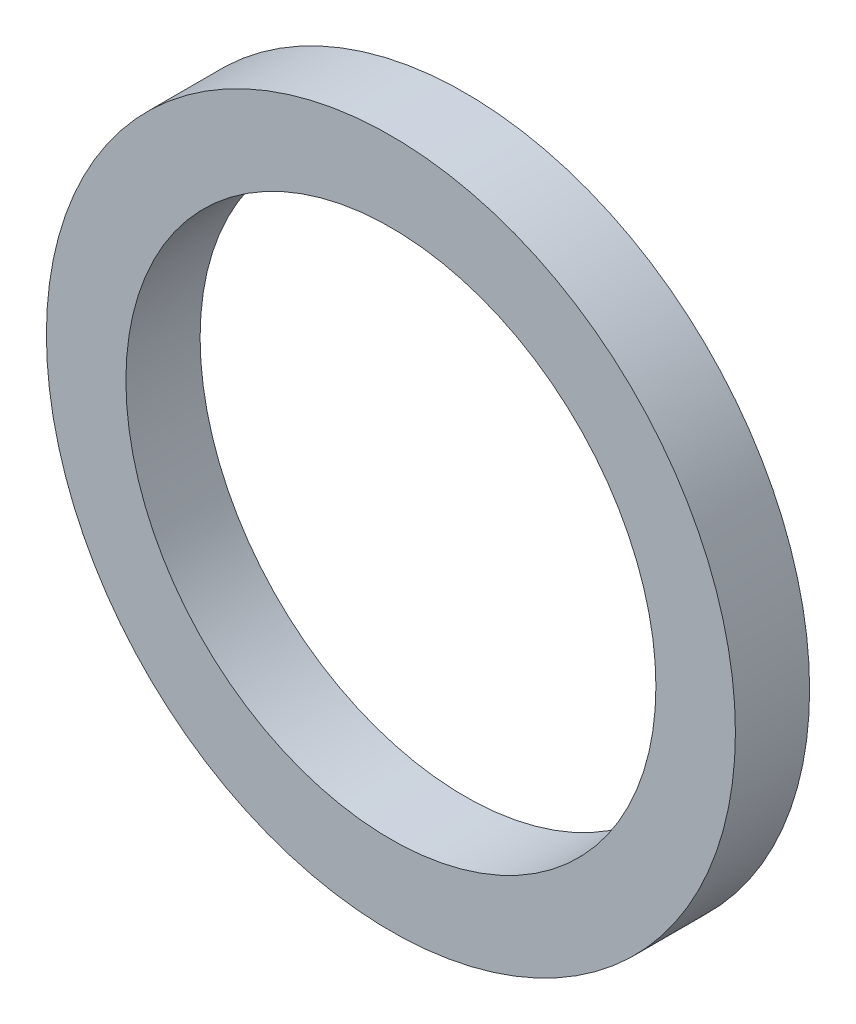
ISO-10303-21;
HEADER;
FILE_DESCRIPTION(('STEP AP214'),'2;1');
FILE_NAME('part.step','',(''),(''),'','','');
FILE_SCHEMA(('AUTOMOTIVE_DESIGN { 1 0 10303 214 1 1 1 1 }'));
ENDSEC;
DATA;
#1=APPLICATION_CONTEXT('core data for automotive mechanical design processes');
#2=APPLICATION_PROTOCOL_DEFINITION('international standard','automotive_design',2000,#1);
#3=PRODUCT_CONTEXT('',#1,'mechanical');
#4=PRODUCT('Part','Part','',(#3));
#5=PRODUCT_RELATED_PRODUCT_CATEGORY('part','',(#4));
#6=PRODUCT_DEFINITION_FORMATION('','',#4);
#7=PRODUCT_DEFINITION_CONTEXT('part definition',#1,'design');
#8=PRODUCT_DEFINITION('design','',#6,#7);
#9=PRODUCT_DEFINITION_SHAPE('','',#8);
#10=(LENGTH_UNIT() NAMED_UNIT(*) SI_UNIT(.MILLI.,.METRE.));
#11=(NAMED_UNIT(*) PLANE_ANGLE_UNIT() SI_UNIT($,.RADIAN.));
#12=(NAMED_UNIT(*) SI_UNIT($,.STERADIAN.) SOLID_ANGLE_UNIT());
#13=UNCERTAINTY_MEASURE_WITH_UNIT(LENGTH_MEASURE(1.E-05),#10,'distance_accuracy_value','');
#14=(GEOMETRIC_REPRESENTATION_CONTEXT(3) GLOBAL_UNCERTAINTY_ASSIGNED_CONTEXT((#13)) GLOBAL_UNIT_ASSIGNED_CONTEXT((#10,
#11,#12)) REPRESENTATION_CONTEXT('',''));
#15=CARTESIAN_POINT('',(0.,0.,0.));
#16=DIRECTION('',(0.,0.,1.));
#17=DIRECTION('',(1.,0.,0.));
#18=AXIS2_PLACEMENT_3D('',#15,#16,#17);
#19=CARTESIAN_POINT('',(0.,0.,7.));
#20=DIRECTION('',(0.,0.,1.));
#21=DIRECTION('',(1.,0.,0.));
#22=AXIS2_PLACEMENT_3D('',#19,#20,#21);
#23=PLANE('',#22);
#24=CARTESIAN_POINT('',(0.,0.,7.));
#25=DIRECTION('',(0.,0.,1.));
#26=DIRECTION('',(1.,0.,0.));
#27=AXIS2_PLACEMENT_3D('',#24,#25,#26);
#28=CIRCLE('',#27,32.5);
#29=CARTESIAN_POINT('',(32.5,0.,7.));
#30=VERTEX_POINT('',#29);
#31=EDGE_CURVE('E10',#30,#30,#28,.T.);
#32=ORIENTED_EDGE('',*,*,#31,.T.);
#33=EDGE_LOOP('',(#32));
#34=FACE_BOUND('',#33,.T.);
#35=CARTESIAN_POINT('',(0.,0.,7.));
#36=DIRECTION('',(0.,0.,1.));
#37=DIRECTION('',(1.,0.,0.));
#38=AXIS2_PLACEMENT_3D('',#35,#36,#37);
#39=CIRCLE('',#38,25.);
#40=CARTESIAN_POINT('',(25.,0.,7.));
#41=VERTEX_POINT('',#40);
#42=EDGE_CURVE('E42',#41,#41,#39,.T.);
#43=ORIENTED_EDGE('',*,*,#42,.F.);
#44=EDGE_LOOP('',(#43));
#45=FACE_BOUND('',#44,.T.);
#46=ADVANCED_FACE('F31',(#34,#45),#23,.T.);
#47=CARTESIAN_POINT('',(0.,0.,0.));
#48=DIRECTION('',(0.,0.,1.));
#49=DIRECTION('',(1.,0.,0.));
#50=AXIS2_PLACEMENT_3D('',#47,#48,#49);
#51=PLANE('',#50);
#52=CARTESIAN_POINT('',(0.,0.,0.));
#53=DIRECTION('',(0.,0.,1.));
#54=DIRECTION('',(1.,0.,0.));
#55=AXIS2_PLACEMENT_3D('',#52,#53,#54);
#56=CIRCLE('',#55,32.5);
#57=CARTESIAN_POINT('',(32.5,0.,0.));
#58=VERTEX_POINT('',#57);
#59=EDGE_CURVE('E35',#58,#58,#56,.T.);
#60=ORIENTED_EDGE('',*,*,#59,.F.);
#61=EDGE_LOOP('',(#60));
#62=FACE_BOUND('',#61,.T.);
#63=CARTESIAN_POINT('',(0.,0.,0.));
#64=DIRECTION('',(0.,0.,1.));
#65=DIRECTION('',(1.,0.,0.));
#66=AXIS2_PLACEMENT_3D('',#63,#64,#65);
#67=CIRCLE('',#66,25.);
#68=CARTESIAN_POINT('',(25.,0.,0.));
#69=VERTEX_POINT('',#68);
#70=EDGE_CURVE('E44',#69,#69,#67,.T.);
#71=ORIENTED_EDGE('',*,*,#70,.T.);
#72=EDGE_LOOP('',(#71));
#73=FACE_BOUND('',#72,.T.);
#74=ADVANCED_FACE('F54',(#62,#73),#51,.F.);
#75=CARTESIAN_POINT('',(0.,0.,7.));
#76=DIRECTION('',(0.,0.,-1.));
#77=DIRECTION('',(-1.,0.,0.));
#78=AXIS2_PLACEMENT_3D('',#75,#76,#77);
#79=CYLINDRICAL_SURFACE('',#78,32.5);
#80=ORIENTED_EDGE('',*,*,#31,.F.);
#81=EDGE_LOOP('',(#80));
#82=FACE_BOUND('',#81,.T.);
#83=ORIENTED_EDGE('',*,*,#59,.T.);
#84=EDGE_LOOP('',(#83));
#85=FACE_BOUND('',#84,.T.);
#86=ADVANCED_FACE('F33',(#82,#85),#79,.T.);
#87=CARTESIAN_POINT('',(0.,0.,7.));
#88=DIRECTION('',(0.,0.,-1.));
#89=DIRECTION('',(-1.,0.,0.));
#90=AXIS2_PLACEMENT_3D('',#87,#88,#89);
#91=CYLINDRICAL_SURFACE('',#90,25.);
#92=ORIENTED_EDGE('',*,*,#42,.T.);
#93=EDGE_LOOP('',(#92));
#94=FACE_BOUND('',#93,.T.);
#95=ORIENTED_EDGE('',*,*,#70,.F.);
#96=EDGE_LOOP('',(#95));
#97=FACE_BOUND('',#96,.T.);
#98=ADVANCED_FACE('F50',(#94,#97),#91,.F.);
#99=CLOSED_SHELL('',(#46,#74,#86,#98));
#100=MANIFOLD_SOLID_BREP('B2',#99);
#101=ADVANCED_BREP_SHAPE_REPRESENTATION('',(#18,#100),#14);
#102=SHAPE_DEFINITION_REPRESENTATION(#9,#101);
ENDSEC;
END-ISO-10303-21;
